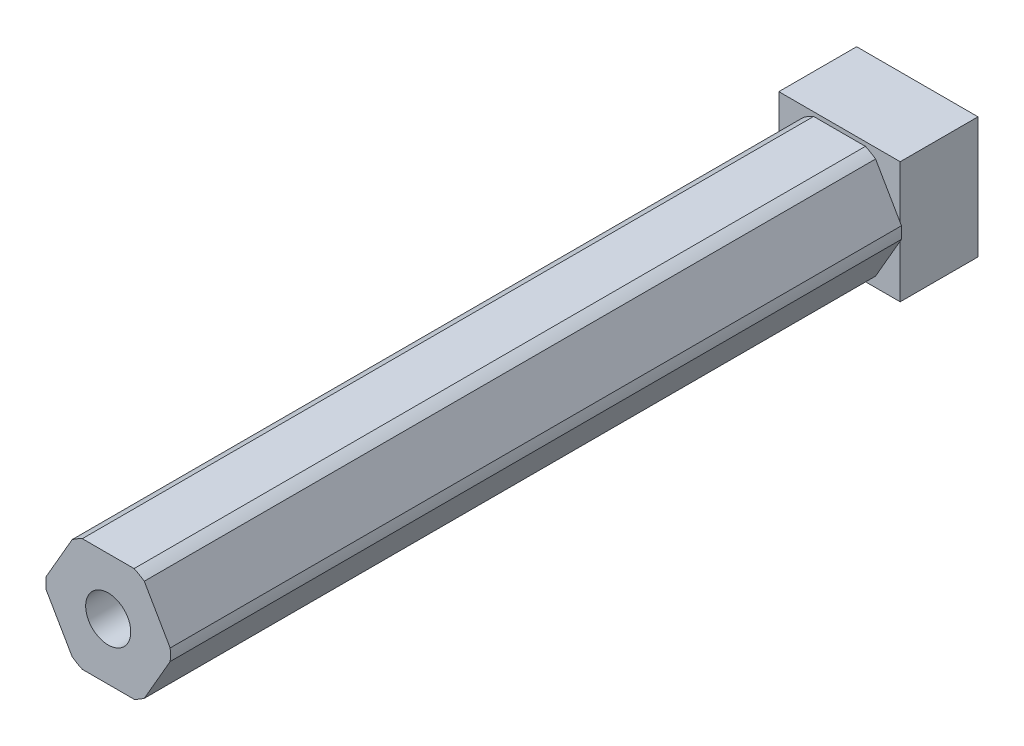
ISO-10303-21;
HEADER;
FILE_DESCRIPTION(('STEP AP214'),'2;1');
FILE_NAME('part.step','',(''),(''),'','','');
FILE_SCHEMA(('AUTOMOTIVE_DESIGN { 1 0 10303 214 1 1 1 1 }'));
ENDSEC;
DATA;
#1=APPLICATION_CONTEXT('core data for automotive mechanical design processes');
#2=APPLICATION_PROTOCOL_DEFINITION('international standard','automotive_design',2000,#1);
#3=PRODUCT_CONTEXT('',#1,'mechanical');
#4=PRODUCT('Part','Part','',(#3));
#5=PRODUCT_RELATED_PRODUCT_CATEGORY('part','',(#4));
#6=PRODUCT_DEFINITION_FORMATION('','',#4);
#7=PRODUCT_DEFINITION_CONTEXT('part definition',#1,'design');
#8=PRODUCT_DEFINITION('design','',#6,#7);
#9=PRODUCT_DEFINITION_SHAPE('','',#8);
#10=(LENGTH_UNIT() NAMED_UNIT(*) SI_UNIT(.MILLI.,.METRE.));
#11=(NAMED_UNIT(*) PLANE_ANGLE_UNIT() SI_UNIT($,.RADIAN.));
#12=(NAMED_UNIT(*) SI_UNIT($,.STERADIAN.) SOLID_ANGLE_UNIT());
#13=UNCERTAINTY_MEASURE_WITH_UNIT(LENGTH_MEASURE(1.E-05),#10,'distance_accuracy_value','');
#14=(GEOMETRIC_REPRESENTATION_CONTEXT(3) GLOBAL_UNCERTAINTY_ASSIGNED_CONTEXT((#13)) GLOBAL_UNIT_ASSIGNED_CONTEXT((#10,
#11,#12)) REPRESENTATION_CONTEXT('',''));
#15=CARTESIAN_POINT('',(0.,0.,0.));
#16=DIRECTION('',(0.,0.,1.));
#17=DIRECTION('',(1.,0.,0.));
#18=AXIS2_PLACEMENT_3D('',#15,#16,#17);
#19=CARTESIAN_POINT('',(0.,0.,0.));
#20=DIRECTION('',(0.,0.,1.));
#21=DIRECTION('',(1.,0.,0.));
#22=AXIS2_PLACEMENT_3D('',#19,#20,#21);
#23=PLANE('',#22);
#24=DIRECTION('',(0.,1.,0.));
#25=VECTOR('',#24,1.);
#26=CARTESIAN_POINT('',(-3.9,-3.9,0.));
#27=LINE('',#26,#25);
#28=CARTESIAN_POINT('',(-3.9,-0.519615242270667,0.));
#29=VERTEX_POINT('',#28);
#30=CARTESIAN_POINT('',(-3.9,0.519615242270666,0.));
#31=VERTEX_POINT('',#30);
#32=EDGE_CURVE('E11',#29,#31,#27,.T.);
#33=ORIENTED_EDGE('',*,*,#32,.F.);
#34=DIRECTION('',(0.5,-0.866025403784439,0.));
#35=VECTOR('',#34,1.);
#36=CARTESIAN_POINT('',(-3.98216584885466,-0.377299817407367,0.));
#37=LINE('',#36,#35);
#38=CARTESIAN_POINT('',(-3.98216584885466,-0.377299817407367,0.));
#39=VERTEX_POINT('',#38);
#40=EDGE_CURVE('E237',#39,#29,#37,.T.);
#41=ORIENTED_EDGE('',*,*,#40,.F.);
#42=CARTESIAN_POINT('',(0.,0.,0.));
#43=DIRECTION('',(0.,0.,1.));
#44=DIRECTION('',(1.,0.,0.));
#45=AXIS2_PLACEMENT_3D('',#42,#43,#44);
#46=CIRCLE('',#45,4.);
#47=CARTESIAN_POINT('',(-3.98216584885466,0.377299817407364,0.));
#48=VERTEX_POINT('',#47);
#49=EDGE_CURVE('E234',#48,#39,#46,.T.);
#50=ORIENTED_EDGE('',*,*,#49,.F.);
#51=DIRECTION('',(-0.5,-0.866025403784439,0.));
#52=VECTOR('',#51,1.);
#53=CARTESIAN_POINT('',(-2.31783415114534,3.26000687848728,0.));
#54=LINE('',#53,#52);
#55=EDGE_CURVE('E60',#31,#48,#54,.T.);
#56=ORIENTED_EDGE('',*,*,#55,.F.);
#57=EDGE_LOOP('',(#33,#41,#50,#56));
#58=FACE_BOUND('',#57,.T.);
#59=ADVANCED_FACE('F41',(#58),#23,.F.);
#60=DIRECTION('',(0.,-1.,0.));
#61=VECTOR('',#60,1.);
#62=CARTESIAN_POINT('',(3.9,-3.9,0.));
#63=LINE('',#62,#61);
#64=CARTESIAN_POINT('',(3.9,0.519615242270664,0.));
#65=VERTEX_POINT('',#64);
#66=CARTESIAN_POINT('',(3.9,-0.51961524227066,0.));
#67=VERTEX_POINT('',#66);
#68=EDGE_CURVE('E50',#65,#67,#63,.T.);
#69=ORIENTED_EDGE('',*,*,#68,.F.);
#70=DIRECTION('',(-0.5,0.866025403784439,0.));
#71=VECTOR('',#70,1.);
#72=CARTESIAN_POINT('',(3.98216584885466,0.377299817407363,0.));
#73=LINE('',#72,#71);
#74=CARTESIAN_POINT('',(3.98216584885466,0.377299817407363,0.));
#75=VERTEX_POINT('',#74);
#76=EDGE_CURVE('E206',#75,#65,#73,.T.);
#77=ORIENTED_EDGE('',*,*,#76,.F.);
#78=CARTESIAN_POINT('',(0.,0.,0.));
#79=DIRECTION('',(0.,0.,1.));
#80=DIRECTION('',(1.,0.,0.));
#81=AXIS2_PLACEMENT_3D('',#78,#79,#80);
#82=CIRCLE('',#81,4.);
#83=CARTESIAN_POINT('',(3.98216584885466,-0.377299817407363,0.));
#84=VERTEX_POINT('',#83);
#85=EDGE_CURVE('E248',#84,#75,#82,.T.);
#86=ORIENTED_EDGE('',*,*,#85,.F.);
#87=DIRECTION('',(0.499999999999999,0.866025403784439,0.));
#88=VECTOR('',#87,1.);
#89=CARTESIAN_POINT('',(2.31783415114534,-3.26000687848728,0.));
#90=LINE('',#89,#88);
#91=EDGE_CURVE('E245',#67,#84,#90,.T.);
#92=ORIENTED_EDGE('',*,*,#91,.F.);
#93=EDGE_LOOP('',(#69,#77,#86,#92));
#94=FACE_BOUND('',#93,.T.);
#95=ADVANCED_FACE('F331',(#94),#23,.F.);
#96=CARTESIAN_POINT('',(0.,0.,47.));
#97=DIRECTION('',(0.,0.,-1.));
#98=DIRECTION('',(-1.,0.,0.));
#99=AXIS2_PLACEMENT_3D('',#96,#97,#98);
#100=CYLINDRICAL_SURFACE('',#99,4.);
#101=CARTESIAN_POINT('',(0.,0.,0.));
#102=DIRECTION('',(0.,0.,1.));
#103=DIRECTION('',(1.,0.,0.));
#104=AXIS2_PLACEMENT_3D('',#101,#102,#103);
#105=CIRCLE('',#104,4.);
#106=CARTESIAN_POINT('',(2.31783415114534,3.26000687848728,0.));
#107=VERTEX_POINT('',#106);
#108=CARTESIAN_POINT('',(1.66433169770932,3.63730669589464,0.));
#109=VERTEX_POINT('',#108);
#110=EDGE_CURVE('E193',#107,#109,#105,.T.);
#111=ORIENTED_EDGE('',*,*,#110,.T.);
#112=DIRECTION('',(0.,0.,-1.));
#113=VECTOR('',#112,1.);
#114=CARTESIAN_POINT('',(1.66433169770932,3.63730669589464,47.));
#115=LINE('',#114,#113);
#116=CARTESIAN_POINT('',(1.66433169770932,3.63730669589464,47.));
#117=VERTEX_POINT('',#116);
#118=EDGE_CURVE('E284',#117,#109,#115,.T.);
#119=ORIENTED_EDGE('',*,*,#118,.F.);
#120=CARTESIAN_POINT('',(0.,0.,47.));
#121=DIRECTION('',(0.,0.,1.));
#122=DIRECTION('',(1.,0.,0.));
#123=AXIS2_PLACEMENT_3D('',#120,#121,#122);
#124=CIRCLE('',#123,4.);
#125=CARTESIAN_POINT('',(2.31783415114534,3.26000687848728,47.));
#126=VERTEX_POINT('',#125);
#127=EDGE_CURVE('E202',#126,#117,#124,.T.);
#128=ORIENTED_EDGE('',*,*,#127,.F.);
#129=DIRECTION('',(0.,0.,-1.));
#130=VECTOR('',#129,1.);
#131=CARTESIAN_POINT('',(2.31783415114534,3.26000687848728,47.));
#132=LINE('',#131,#130);
#133=EDGE_CURVE('E227',#126,#107,#132,.T.);
#134=ORIENTED_EDGE('',*,*,#133,.T.);
#135=EDGE_LOOP('',(#111,#119,#128,#134));
#136=FACE_BOUND('',#135,.T.);
#137=ADVANCED_FACE('F43',(#136),#100,.T.);
#138=CARTESIAN_POINT('',(1.66433169770932,3.63730669589464,47.));
#139=DIRECTION('',(0.,-1.,0.));
#140=DIRECTION('',(0.,0.,-1.));
#141=AXIS2_PLACEMENT_3D('',#138,#139,#140);
#142=PLANE('',#141);
#143=DIRECTION('',(-1.,0.,0.));
#144=VECTOR('',#143,1.);
#145=CARTESIAN_POINT('',(1.66433169770932,3.63730669589464,0.));
#146=LINE('',#145,#144);
#147=CARTESIAN_POINT('',(-1.66433169770932,3.63730669589464,0.));
#148=VERTEX_POINT('',#147);
#149=EDGE_CURVE('E196',#109,#148,#146,.T.);
#150=ORIENTED_EDGE('',*,*,#149,.T.);
#151=DIRECTION('',(0.,0.,-1.));
#152=VECTOR('',#151,1.);
#153=CARTESIAN_POINT('',(-1.66433169770932,3.63730669589464,47.));
#154=LINE('',#153,#152);
#155=CARTESIAN_POINT('',(-1.66433169770932,3.63730669589464,47.));
#156=VERTEX_POINT('',#155);
#157=EDGE_CURVE('E282',#156,#148,#154,.T.);
#158=ORIENTED_EDGE('',*,*,#157,.F.);
#159=DIRECTION('',(-1.,0.,0.));
#160=VECTOR('',#159,1.);
#161=CARTESIAN_POINT('',(1.66433169770932,3.63730669589464,47.));
#162=LINE('',#161,#160);
#163=EDGE_CURVE('E205',#117,#156,#162,.T.);
#164=ORIENTED_EDGE('',*,*,#163,.F.);
#165=ORIENTED_EDGE('',*,*,#118,.T.);
#166=EDGE_LOOP('',(#150,#158,#164,#165));
#167=FACE_BOUND('',#166,.T.);
#168=ADVANCED_FACE('F379',(#167),#142,.F.);
#169=CARTESIAN_POINT('',(0.,0.,47.));
#170=DIRECTION('',(0.,0.,-1.));
#171=DIRECTION('',(-1.,0.,0.));
#172=AXIS2_PLACEMENT_3D('',#169,#170,#171);
#173=CYLINDRICAL_SURFACE('',#172,4.);
#174=CARTESIAN_POINT('',(0.,0.,0.));
#175=DIRECTION('',(0.,0.,1.));
#176=DIRECTION('',(1.,0.,0.));
#177=AXIS2_PLACEMENT_3D('',#174,#175,#176);
#178=CIRCLE('',#177,4.);
#179=CARTESIAN_POINT('',(-2.31783415114534,3.26000687848728,0.));
#180=VERTEX_POINT('',#179);
#181=EDGE_CURVE('E230',#148,#180,#178,.T.);
#182=ORIENTED_EDGE('',*,*,#181,.T.);
#183=DIRECTION('',(0.,0.,-1.));
#184=VECTOR('',#183,1.);
#185=CARTESIAN_POINT('',(-2.31783415114534,3.26000687848728,47.));
#186=LINE('',#185,#184);
#187=CARTESIAN_POINT('',(-2.31783415114534,3.26000687848728,47.));
#188=VERTEX_POINT('',#187);
#189=EDGE_CURVE('E279',#188,#180,#186,.T.);
#190=ORIENTED_EDGE('',*,*,#189,.F.);
#191=CARTESIAN_POINT('',(0.,0.,47.));
#192=DIRECTION('',(0.,0.,1.));
#193=DIRECTION('',(1.,0.,0.));
#194=AXIS2_PLACEMENT_3D('',#191,#192,#193);
#195=CIRCLE('',#194,4.);
#196=EDGE_CURVE('E208',#156,#188,#195,.T.);
#197=ORIENTED_EDGE('',*,*,#196,.F.);
#198=ORIENTED_EDGE('',*,*,#157,.T.);
#199=EDGE_LOOP('',(#182,#190,#197,#198));
#200=FACE_BOUND('',#199,.T.);
#201=ADVANCED_FACE('F376',(#200),#173,.T.);
#202=CARTESIAN_POINT('',(-2.31783415114534,3.26000687848728,47.));
#203=DIRECTION('',(0.866025403784439,-0.5,0.));
#204=DIRECTION('',(0.5,0.866025403784439,0.));
#205=AXIS2_PLACEMENT_3D('',#202,#203,#204);
#206=PLANE('',#205);
#207=EDGE_CURVE('E232',#180,#31,#54,.T.);
#208=ORIENTED_EDGE('',*,*,#207,.T.);
#209=ORIENTED_EDGE('',*,*,#55,.T.);
#210=DIRECTION('',(0.,0.,-1.));
#211=VECTOR('',#210,1.);
#212=CARTESIAN_POINT('',(-3.98216584885466,0.377299817407364,47.));
#213=LINE('',#212,#211);
#214=CARTESIAN_POINT('',(-3.98216584885466,0.377299817407364,47.));
#215=VERTEX_POINT('',#214);
#216=EDGE_CURVE('E276',#215,#48,#213,.T.);
#217=ORIENTED_EDGE('',*,*,#216,.F.);
#218=DIRECTION('',(-0.5,-0.866025403784439,0.));
#219=VECTOR('',#218,1.);
#220=CARTESIAN_POINT('',(-2.31783415114534,3.26000687848728,47.));
#221=LINE('',#220,#219);
#222=EDGE_CURVE('E210',#188,#215,#221,.T.);
#223=ORIENTED_EDGE('',*,*,#222,.F.);
#224=ORIENTED_EDGE('',*,*,#189,.T.);
#225=EDGE_LOOP('',(#208,#209,#217,#223,#224));
#226=FACE_BOUND('',#225,.T.);
#227=ADVANCED_FACE('F372',(#226),#206,.F.);
#228=CARTESIAN_POINT('',(0.,0.,47.));
#229=DIRECTION('',(0.,0.,-1.));
#230=DIRECTION('',(-1.,0.,0.));
#231=AXIS2_PLACEMENT_3D('',#228,#229,#230);
#232=CYLINDRICAL_SURFACE('',#231,4.);
#233=ORIENTED_EDGE('',*,*,#49,.T.);
#234=DIRECTION('',(0.,0.,-1.));
#235=VECTOR('',#234,1.);
#236=CARTESIAN_POINT('',(-3.98216584885466,-0.377299817407367,47.));
#237=LINE('',#236,#235);
#238=CARTESIAN_POINT('',(-3.98216584885466,-0.377299817407367,47.));
#239=VERTEX_POINT('',#238);
#240=EDGE_CURVE('E273',#239,#39,#237,.T.);
#241=ORIENTED_EDGE('',*,*,#240,.F.);
#242=CARTESIAN_POINT('',(0.,0.,47.));
#243=DIRECTION('',(0.,0.,1.));
#244=DIRECTION('',(1.,0.,0.));
#245=AXIS2_PLACEMENT_3D('',#242,#243,#244);
#246=CIRCLE('',#245,4.);
#247=EDGE_CURVE('E212',#215,#239,#246,.T.);
#248=ORIENTED_EDGE('',*,*,#247,.F.);
#249=ORIENTED_EDGE('',*,*,#216,.T.);
#250=EDGE_LOOP('',(#233,#241,#248,#249));
#251=FACE_BOUND('',#250,.T.);
#252=ADVANCED_FACE('F368',(#251),#232,.T.);
#253=CARTESIAN_POINT('',(-3.98216584885466,-0.377299817407367,47.));
#254=DIRECTION('',(0.866025403784438,0.5,0.));
#255=DIRECTION('',(-0.5,0.866025403784439,0.));
#256=AXIS2_PLACEMENT_3D('',#253,#254,#255);
#257=PLANE('',#256);
#258=ORIENTED_EDGE('',*,*,#40,.T.);
#259=CARTESIAN_POINT('',(-2.31783415114534,-3.26000687848728,0.));
#260=VERTEX_POINT('',#259);
#261=EDGE_CURVE('E236',#29,#260,#37,.T.);
#262=ORIENTED_EDGE('',*,*,#261,.T.);
#263=DIRECTION('',(0.,0.,-1.));
#264=VECTOR('',#263,1.);
#265=CARTESIAN_POINT('',(-2.31783415114534,-3.26000687848728,47.));
#266=LINE('',#265,#264);
#267=CARTESIAN_POINT('',(-2.31783415114534,-3.26000687848728,47.));
#268=VERTEX_POINT('',#267);
#269=EDGE_CURVE('E270',#268,#260,#266,.T.);
#270=ORIENTED_EDGE('',*,*,#269,.F.);
#271=DIRECTION('',(0.5,-0.866025403784439,0.));
#272=VECTOR('',#271,1.);
#273=CARTESIAN_POINT('',(-3.98216584885466,-0.377299817407367,47.));
#274=LINE('',#273,#272);
#275=EDGE_CURVE('E214',#239,#268,#274,.T.);
#276=ORIENTED_EDGE('',*,*,#275,.F.);
#277=ORIENTED_EDGE('',*,*,#240,.T.);
#278=EDGE_LOOP('',(#258,#262,#270,#276,#277));
#279=FACE_BOUND('',#278,.T.);
#280=ADVANCED_FACE('F364',(#279),#257,.F.);
#281=CARTESIAN_POINT('',(0.,0.,47.));
#282=DIRECTION('',(0.,0.,-1.));
#283=DIRECTION('',(-1.,0.,0.));
#284=AXIS2_PLACEMENT_3D('',#281,#282,#283);
#285=CYLINDRICAL_SURFACE('',#284,4.);
#286=CARTESIAN_POINT('',(0.,0.,0.));
#287=DIRECTION('',(0.,0.,1.));
#288=DIRECTION('',(1.,0.,0.));
#289=AXIS2_PLACEMENT_3D('',#286,#287,#288);
#290=CIRCLE('',#289,4.);
#291=CARTESIAN_POINT('',(-1.66433169770932,-3.63730669589464,0.));
#292=VERTEX_POINT('',#291);
#293=EDGE_CURVE('E239',#260,#292,#290,.T.);
#294=ORIENTED_EDGE('',*,*,#293,.T.);
#295=DIRECTION('',(0.,0.,-1.));
#296=VECTOR('',#295,1.);
#297=CARTESIAN_POINT('',(-1.66433169770932,-3.63730669589464,47.));
#298=LINE('',#297,#296);
#299=CARTESIAN_POINT('',(-1.66433169770932,-3.63730669589464,47.));
#300=VERTEX_POINT('',#299);
#301=EDGE_CURVE('E267',#300,#292,#298,.T.);
#302=ORIENTED_EDGE('',*,*,#301,.F.);
#303=CARTESIAN_POINT('',(0.,0.,47.));
#304=DIRECTION('',(0.,0.,1.));
#305=DIRECTION('',(1.,0.,0.));
#306=AXIS2_PLACEMENT_3D('',#303,#304,#305);
#307=CIRCLE('',#306,4.);
#308=EDGE_CURVE('E216',#268,#300,#307,.T.);
#309=ORIENTED_EDGE('',*,*,#308,.F.);
#310=ORIENTED_EDGE('',*,*,#269,.T.);
#311=EDGE_LOOP('',(#294,#302,#309,#310));
#312=FACE_BOUND('',#311,.T.);
#313=ADVANCED_FACE('F360',(#312),#285,.T.);
#314=CARTESIAN_POINT('',(-1.66433169770932,-3.63730669589464,47.));
#315=DIRECTION('',(0.,1.,0.));
#316=DIRECTION('',(0.,0.,1.));
#317=AXIS2_PLACEMENT_3D('',#314,#315,#316);
#318=PLANE('',#317);
#319=DIRECTION('',(1.,0.,0.));
#320=VECTOR('',#319,1.);
#321=CARTESIAN_POINT('',(-1.66433169770932,-3.63730669589464,0.));
#322=LINE('',#321,#320);
#323=CARTESIAN_POINT('',(1.66433169770932,-3.63730669589464,0.));
#324=VERTEX_POINT('',#323);
#325=EDGE_CURVE('E241',#292,#324,#322,.T.);
#326=ORIENTED_EDGE('',*,*,#325,.T.);
#327=DIRECTION('',(0.,0.,-1.));
#328=VECTOR('',#327,1.);
#329=CARTESIAN_POINT('',(1.66433169770932,-3.63730669589464,47.));
#330=LINE('',#329,#328);
#331=CARTESIAN_POINT('',(1.66433169770932,-3.63730669589464,47.));
#332=VERTEX_POINT('',#331);
#333=EDGE_CURVE('E264',#332,#324,#330,.T.);
#334=ORIENTED_EDGE('',*,*,#333,.F.);
#335=DIRECTION('',(1.,0.,0.));
#336=VECTOR('',#335,1.);
#337=CARTESIAN_POINT('',(-1.66433169770932,-3.63730669589464,47.));
#338=LINE('',#337,#336);
#339=EDGE_CURVE('E218',#300,#332,#338,.T.);
#340=ORIENTED_EDGE('',*,*,#339,.F.);
#341=ORIENTED_EDGE('',*,*,#301,.T.);
#342=EDGE_LOOP('',(#326,#334,#340,#341));
#343=FACE_BOUND('',#342,.T.);
#344=ADVANCED_FACE('F356',(#343),#318,.F.);
#345=CARTESIAN_POINT('',(0.,0.,47.));
#346=DIRECTION('',(0.,0.,-1.));
#347=DIRECTION('',(-1.,0.,0.));
#348=AXIS2_PLACEMENT_3D('',#345,#346,#347);
#349=CYLINDRICAL_SURFACE('',#348,4.);
#350=CARTESIAN_POINT('',(0.,0.,0.));
#351=DIRECTION('',(0.,0.,1.));
#352=DIRECTION('',(1.,0.,0.));
#353=AXIS2_PLACEMENT_3D('',#350,#351,#352);
#354=CIRCLE('',#353,4.);
#355=CARTESIAN_POINT('',(2.31783415114534,-3.26000687848728,0.));
#356=VERTEX_POINT('',#355);
#357=EDGE_CURVE('E243',#324,#356,#354,.T.);
#358=ORIENTED_EDGE('',*,*,#357,.T.);
#359=DIRECTION('',(0.,0.,-1.));
#360=VECTOR('',#359,1.);
#361=CARTESIAN_POINT('',(2.31783415114534,-3.26000687848728,47.));
#362=LINE('',#361,#360);
#363=CARTESIAN_POINT('',(2.31783415114534,-3.26000687848728,47.));
#364=VERTEX_POINT('',#363);
#365=EDGE_CURVE('E261',#364,#356,#362,.T.);
#366=ORIENTED_EDGE('',*,*,#365,.F.);
#367=CARTESIAN_POINT('',(0.,0.,47.));
#368=DIRECTION('',(0.,0.,1.));
#369=DIRECTION('',(1.,0.,0.));
#370=AXIS2_PLACEMENT_3D('',#367,#368,#369);
#371=CIRCLE('',#370,4.);
#372=EDGE_CURVE('E220',#332,#364,#371,.T.);
#373=ORIENTED_EDGE('',*,*,#372,.F.);
#374=ORIENTED_EDGE('',*,*,#333,.T.);
#375=EDGE_LOOP('',(#358,#366,#373,#374));
#376=FACE_BOUND('',#375,.T.);
#377=ADVANCED_FACE('F352',(#376),#349,.T.);
#378=CARTESIAN_POINT('',(2.31783415114534,-3.26000687848728,47.));
#379=DIRECTION('',(-0.866025403784439,0.499999999999999,0.));
#380=DIRECTION('',(-0.499999999999999,-0.866025403784439,0.));
#381=AXIS2_PLACEMENT_3D('',#378,#379,#380);
#382=PLANE('',#381);
#383=EDGE_CURVE('E246',#356,#67,#90,.T.);
#384=ORIENTED_EDGE('',*,*,#383,.T.);
#385=ORIENTED_EDGE('',*,*,#91,.T.);
#386=DIRECTION('',(0.,0.,-1.));
#387=VECTOR('',#386,1.);
#388=CARTESIAN_POINT('',(3.98216584885466,-0.377299817407363,47.));
#389=LINE('',#388,#387);
#390=CARTESIAN_POINT('',(3.98216584885466,-0.377299817407363,47.));
#391=VERTEX_POINT('',#390);
#392=EDGE_CURVE('E258',#391,#84,#389,.T.);
#393=ORIENTED_EDGE('',*,*,#392,.F.);
#394=DIRECTION('',(0.499999999999999,0.866025403784439,0.));
#395=VECTOR('',#394,1.);
#396=CARTESIAN_POINT('',(2.31783415114534,-3.26000687848728,47.));
#397=LINE('',#396,#395);
#398=EDGE_CURVE('E222',#364,#391,#397,.T.);
#399=ORIENTED_EDGE('',*,*,#398,.F.);
#400=ORIENTED_EDGE('',*,*,#365,.T.);
#401=EDGE_LOOP('',(#384,#385,#393,#399,#400));
#402=FACE_BOUND('',#401,.T.);
#403=ADVANCED_FACE('F348',(#402),#382,.F.);
#404=CARTESIAN_POINT('',(0.,0.,47.));
#405=DIRECTION('',(0.,0.,-1.));
#406=DIRECTION('',(-1.,0.,0.));
#407=AXIS2_PLACEMENT_3D('',#404,#405,#406);
#408=CYLINDRICAL_SURFACE('',#407,4.);
#409=ORIENTED_EDGE('',*,*,#85,.T.);
#410=DIRECTION('',(0.,0.,-1.));
#411=VECTOR('',#410,1.);
#412=CARTESIAN_POINT('',(3.98216584885466,0.377299817407363,47.));
#413=LINE('',#412,#411);
#414=CARTESIAN_POINT('',(3.98216584885466,0.377299817407363,47.));
#415=VERTEX_POINT('',#414);
#416=EDGE_CURVE('E255',#415,#75,#413,.T.);
#417=ORIENTED_EDGE('',*,*,#416,.F.);
#418=CARTESIAN_POINT('',(0.,0.,47.));
#419=DIRECTION('',(0.,0.,1.));
#420=DIRECTION('',(1.,0.,0.));
#421=AXIS2_PLACEMENT_3D('',#418,#419,#420);
#422=CIRCLE('',#421,4.);
#423=EDGE_CURVE('E224',#391,#415,#422,.T.);
#424=ORIENTED_EDGE('',*,*,#423,.F.);
#425=ORIENTED_EDGE('',*,*,#392,.T.);
#426=EDGE_LOOP('',(#409,#417,#424,#425));
#427=FACE_BOUND('',#426,.T.);
#428=ADVANCED_FACE('F345',(#427),#408,.T.);
#429=CARTESIAN_POINT('',(3.98216584885466,0.377299817407363,47.));
#430=DIRECTION('',(-0.866025403784439,-0.5,0.));
#431=DIRECTION('',(0.5,-0.866025403784439,0.));
#432=AXIS2_PLACEMENT_3D('',#429,#430,#431);
#433=PLANE('',#432);
#434=ORIENTED_EDGE('',*,*,#76,.T.);
#435=EDGE_CURVE('E250',#65,#107,#73,.T.);
#436=ORIENTED_EDGE('',*,*,#435,.T.);
#437=ORIENTED_EDGE('',*,*,#133,.F.);
#438=DIRECTION('',(-0.5,0.866025403784439,0.));
#439=VECTOR('',#438,1.);
#440=CARTESIAN_POINT('',(3.98216584885466,0.377299817407363,47.));
#441=LINE('',#440,#439);
#442=EDGE_CURVE('E226',#415,#126,#441,.T.);
#443=ORIENTED_EDGE('',*,*,#442,.F.);
#444=ORIENTED_EDGE('',*,*,#416,.T.);
#445=EDGE_LOOP('',(#434,#436,#437,#443,#444));
#446=FACE_BOUND('',#445,.T.);
#447=ADVANCED_FACE('F342',(#446),#433,.F.);
#448=CARTESIAN_POINT('',(0.,0.,47.));
#449=DIRECTION('',(0.,0.,1.));
#450=DIRECTION('',(1.,0.,0.));
#451=AXIS2_PLACEMENT_3D('',#448,#449,#450);
#452=PLANE('',#451);
#453=CARTESIAN_POINT('',(0.,0.,47.));
#454=DIRECTION('',(0.,0.,-1.));
#455=DIRECTION('',(-1.,0.,0.));
#456=AXIS2_PLACEMENT_3D('',#453,#454,#455);
#457=CIRCLE('',#456,1.45);
#458=CARTESIAN_POINT('',(-1.45,0.,47.));
#459=VERTEX_POINT('',#458);
#460=EDGE_CURVE('E313',#459,#459,#457,.T.);
#461=ORIENTED_EDGE('',*,*,#460,.T.);
#462=EDGE_LOOP('',(#461));
#463=FACE_BOUND('',#462,.T.);
#464=ORIENTED_EDGE('',*,*,#127,.T.);
#465=ORIENTED_EDGE('',*,*,#163,.T.);
#466=ORIENTED_EDGE('',*,*,#196,.T.);
#467=ORIENTED_EDGE('',*,*,#222,.T.);
#468=ORIENTED_EDGE('',*,*,#247,.T.);
#469=ORIENTED_EDGE('',*,*,#275,.T.);
#470=ORIENTED_EDGE('',*,*,#308,.T.);
#471=ORIENTED_EDGE('',*,*,#339,.T.);
#472=ORIENTED_EDGE('',*,*,#372,.T.);
#473=ORIENTED_EDGE('',*,*,#398,.T.);
#474=ORIENTED_EDGE('',*,*,#423,.T.);
#475=ORIENTED_EDGE('',*,*,#442,.T.);
#476=EDGE_LOOP('',(#464,#465,#466,#467,#468,#469,#470,#471,#472,#473,#474,#475));
#477=FACE_BOUND('',#476,.T.);
#478=ADVANCED_FACE('F340',(#463,#477),#452,.T.);
#479=CARTESIAN_POINT('',(0.,0.,0.));
#480=DIRECTION('',(0.,0.,1.));
#481=DIRECTION('',(1.,0.,0.));
#482=AXIS2_PLACEMENT_3D('',#479,#480,#481);
#483=PLANE('',#482);
#484=ORIENTED_EDGE('',*,*,#383,.F.);
#485=ORIENTED_EDGE('',*,*,#357,.F.);
#486=ORIENTED_EDGE('',*,*,#325,.F.);
#487=ORIENTED_EDGE('',*,*,#293,.F.);
#488=ORIENTED_EDGE('',*,*,#261,.F.);
#489=CARTESIAN_POINT('',(-3.9,-3.9,0.));
#490=VERTEX_POINT('',#489);
#491=EDGE_CURVE('E52',#490,#29,#27,.T.);
#492=ORIENTED_EDGE('',*,*,#491,.F.);
#493=DIRECTION('',(-1.,0.,0.));
#494=VECTOR('',#493,1.);
#495=CARTESIAN_POINT('',(3.9,-3.9,0.));
#496=LINE('',#495,#494);
#497=CARTESIAN_POINT('',(3.9,-3.9,0.));
#498=VERTEX_POINT('',#497);
#499=EDGE_CURVE('E187',#498,#490,#496,.T.);
#500=ORIENTED_EDGE('',*,*,#499,.F.);
#501=EDGE_CURVE('E290',#67,#498,#63,.T.);
#502=ORIENTED_EDGE('',*,*,#501,.F.);
#503=EDGE_LOOP('',(#484,#485,#486,#487,#488,#492,#500,#502));
#504=FACE_BOUND('',#503,.T.);
#505=ADVANCED_FACE('F414',(#504),#483,.T.);
#506=ORIENTED_EDGE('',*,*,#435,.F.);
#507=CARTESIAN_POINT('',(3.9,3.9,0.));
#508=VERTEX_POINT('',#507);
#509=EDGE_CURVE('E289',#508,#65,#63,.T.);
#510=ORIENTED_EDGE('',*,*,#509,.F.);
#511=DIRECTION('',(1.,0.,0.));
#512=VECTOR('',#511,1.);
#513=CARTESIAN_POINT('',(3.9,3.9,0.));
#514=LINE('',#513,#512);
#515=CARTESIAN_POINT('',(-3.9,3.9,0.));
#516=VERTEX_POINT('',#515);
#517=EDGE_CURVE('E295',#516,#508,#514,.T.);
#518=ORIENTED_EDGE('',*,*,#517,.F.);
#519=EDGE_CURVE('E53',#31,#516,#27,.T.);
#520=ORIENTED_EDGE('',*,*,#519,.F.);
#521=ORIENTED_EDGE('',*,*,#207,.F.);
#522=ORIENTED_EDGE('',*,*,#181,.F.);
#523=ORIENTED_EDGE('',*,*,#149,.F.);
#524=ORIENTED_EDGE('',*,*,#110,.F.);
#525=EDGE_LOOP('',(#506,#510,#518,#520,#521,#522,#523,#524));
#526=FACE_BOUND('',#525,.T.);
#527=ADVANCED_FACE('F395',(#526),#483,.T.);
#528=CARTESIAN_POINT('',(-3.9,-3.9,-5.));
#529=DIRECTION('',(1.,0.,0.));
#530=DIRECTION('',(0.,0.,-1.));
#531=AXIS2_PLACEMENT_3D('',#528,#529,#530);
#532=PLANE('',#531);
#533=ORIENTED_EDGE('',*,*,#491,.T.);
#534=ORIENTED_EDGE('',*,*,#32,.T.);
#535=ORIENTED_EDGE('',*,*,#519,.T.);
#536=DIRECTION('',(0.,0.,1.));
#537=VECTOR('',#536,1.);
#538=CARTESIAN_POINT('',(-3.9,3.9,-5.));
#539=LINE('',#538,#537);
#540=CARTESIAN_POINT('',(-3.9,3.9,-5.));
#541=VERTEX_POINT('',#540);
#542=EDGE_CURVE('E172',#541,#516,#539,.T.);
#543=ORIENTED_EDGE('',*,*,#542,.F.);
#544=DIRECTION('',(0.,1.,0.));
#545=VECTOR('',#544,1.);
#546=CARTESIAN_POINT('',(-3.9,-3.9,-5.));
#547=LINE('',#546,#545);
#548=CARTESIAN_POINT('',(-3.9,-3.9,-5.));
#549=VERTEX_POINT('',#548);
#550=EDGE_CURVE('E178',#549,#541,#547,.T.);
#551=ORIENTED_EDGE('',*,*,#550,.F.);
#552=DIRECTION('',(0.,0.,1.));
#553=VECTOR('',#552,1.);
#554=CARTESIAN_POINT('',(-3.9,-3.9,-5.));
#555=LINE('',#554,#553);
#556=EDGE_CURVE('E301',#549,#490,#555,.T.);
#557=ORIENTED_EDGE('',*,*,#556,.T.);
#558=EDGE_LOOP('',(#533,#534,#535,#543,#551,#557));
#559=FACE_BOUND('',#558,.T.);
#560=ADVANCED_FACE('F190',(#559),#532,.F.);
#561=CARTESIAN_POINT('',(3.9,3.9,-5.));
#562=DIRECTION('',(0.,-1.,0.));
#563=DIRECTION('',(0.,0.,-1.));
#564=AXIS2_PLACEMENT_3D('',#561,#562,#563);
#565=PLANE('',#564);
#566=ORIENTED_EDGE('',*,*,#517,.T.);
#567=DIRECTION('',(0.,0.,1.));
#568=VECTOR('',#567,1.);
#569=CARTESIAN_POINT('',(3.9,3.9,-5.));
#570=LINE('',#569,#568);
#571=CARTESIAN_POINT('',(3.9,3.9,-5.));
#572=VERTEX_POINT('',#571);
#573=EDGE_CURVE('E174',#572,#508,#570,.T.);
#574=ORIENTED_EDGE('',*,*,#573,.F.);
#575=DIRECTION('',(1.,0.,0.));
#576=VECTOR('',#575,1.);
#577=CARTESIAN_POINT('',(3.9,3.9,-5.));
#578=LINE('',#577,#576);
#579=EDGE_CURVE('E168',#541,#572,#578,.T.);
#580=ORIENTED_EDGE('',*,*,#579,.F.);
#581=ORIENTED_EDGE('',*,*,#542,.T.);
#582=EDGE_LOOP('',(#566,#574,#580,#581));
#583=FACE_BOUND('',#582,.T.);
#584=ADVANCED_FACE('F170',(#583),#565,.F.);
#585=CARTESIAN_POINT('',(3.9,-3.9,-5.));
#586=DIRECTION('',(-1.,0.,0.));
#587=DIRECTION('',(0.,0.,1.));
#588=AXIS2_PLACEMENT_3D('',#585,#586,#587);
#589=PLANE('',#588);
#590=ORIENTED_EDGE('',*,*,#509,.T.);
#591=ORIENTED_EDGE('',*,*,#68,.T.);
#592=ORIENTED_EDGE('',*,*,#501,.T.);
#593=DIRECTION('',(0.,0.,1.));
#594=VECTOR('',#593,1.);
#595=CARTESIAN_POINT('',(3.9,-3.9,-5.));
#596=LINE('',#595,#594);
#597=CARTESIAN_POINT('',(3.9,-3.9,-5.));
#598=VERTEX_POINT('',#597);
#599=EDGE_CURVE('E198',#598,#498,#596,.T.);
#600=ORIENTED_EDGE('',*,*,#599,.F.);
#601=DIRECTION('',(0.,-1.,0.));
#602=VECTOR('',#601,1.);
#603=CARTESIAN_POINT('',(3.9,-3.9,-5.));
#604=LINE('',#603,#602);
#605=EDGE_CURVE('E177',#572,#598,#604,.T.);
#606=ORIENTED_EDGE('',*,*,#605,.F.);
#607=ORIENTED_EDGE('',*,*,#573,.T.);
#608=EDGE_LOOP('',(#590,#591,#592,#600,#606,#607));
#609=FACE_BOUND('',#608,.T.);
#610=ADVANCED_FACE('F405',(#609),#589,.F.);
#611=CARTESIAN_POINT('',(3.9,-3.9,-5.));
#612=DIRECTION('',(0.,1.,0.));
#613=DIRECTION('',(0.,0.,1.));
#614=AXIS2_PLACEMENT_3D('',#611,#612,#613);
#615=PLANE('',#614);
#616=ORIENTED_EDGE('',*,*,#499,.T.);
#617=ORIENTED_EDGE('',*,*,#556,.F.);
#618=DIRECTION('',(-1.,0.,0.));
#619=VECTOR('',#618,1.);
#620=CARTESIAN_POINT('',(3.9,-3.9,-5.));
#621=LINE('',#620,#619);
#622=EDGE_CURVE('E183',#598,#549,#621,.T.);
#623=ORIENTED_EDGE('',*,*,#622,.F.);
#624=ORIENTED_EDGE('',*,*,#599,.T.);
#625=EDGE_LOOP('',(#616,#617,#623,#624));
#626=FACE_BOUND('',#625,.T.);
#627=ADVANCED_FACE('F408',(#626),#615,.F.);
#628=CARTESIAN_POINT('',(0.,0.,-5.));
#629=DIRECTION('',(0.,0.,1.));
#630=DIRECTION('',(1.,0.,0.));
#631=AXIS2_PLACEMENT_3D('',#628,#629,#630);
#632=PLANE('',#631);
#633=CARTESIAN_POINT('',(0.,0.,-5.));
#634=DIRECTION('',(0.,0.,-1.));
#635=DIRECTION('',(-1.,0.,0.));
#636=AXIS2_PLACEMENT_3D('',#633,#634,#635);
#637=CIRCLE('',#636,3.);
#638=CARTESIAN_POINT('',(-3.,0.,-5.));
#639=VERTEX_POINT('',#638);
#640=EDGE_CURVE('E306',#639,#639,#637,.T.);
#641=ORIENTED_EDGE('',*,*,#640,.F.);
#642=EDGE_LOOP('',(#641));
#643=FACE_BOUND('',#642,.T.);
#644=ORIENTED_EDGE('',*,*,#550,.T.);
#645=ORIENTED_EDGE('',*,*,#579,.T.);
#646=ORIENTED_EDGE('',*,*,#605,.T.);
#647=ORIENTED_EDGE('',*,*,#622,.T.);
#648=EDGE_LOOP('',(#644,#645,#646,#647));
#649=FACE_BOUND('',#648,.T.);
#650=ADVANCED_FACE('F181',(#643,#649),#632,.F.);
#651=CARTESIAN_POINT('',(0.,0.,-2.));
#652=DIRECTION('',(0.,0.,-1.));
#653=DIRECTION('',(-1.,0.,0.));
#654=AXIS2_PLACEMENT_3D('',#651,#652,#653);
#655=PLANE('',#654);
#656=CARTESIAN_POINT('',(0.,0.,-2.));
#657=DIRECTION('',(0.,0.,-1.));
#658=DIRECTION('',(-1.,0.,0.));
#659=AXIS2_PLACEMENT_3D('',#656,#657,#658);
#660=CIRCLE('',#659,3.);
#661=CARTESIAN_POINT('',(-3.,0.,-2.));
#662=VERTEX_POINT('',#661);
#663=EDGE_CURVE('E309',#662,#662,#660,.T.);
#664=ORIENTED_EDGE('',*,*,#663,.T.);
#665=EDGE_LOOP('',(#664));
#666=FACE_BOUND('',#665,.T.);
#667=CARTESIAN_POINT('',(0.,0.,-2.));
#668=DIRECTION('',(0.,0.,-1.));
#669=DIRECTION('',(-1.,0.,0.));
#670=AXIS2_PLACEMENT_3D('',#667,#668,#669);
#671=CIRCLE('',#670,1.45);
#672=CARTESIAN_POINT('',(-1.45,0.,-2.));
#673=VERTEX_POINT('',#672);
#674=EDGE_CURVE('E45',#673,#673,#671,.F.);
#675=ORIENTED_EDGE('',*,*,#674,.T.);
#676=EDGE_LOOP('',(#675));
#677=FACE_BOUND('',#676,.T.);
#678=ADVANCED_FACE('F486',(#666,#677),#655,.T.);
#679=CARTESIAN_POINT('',(0.,0.,-2.));
#680=DIRECTION('',(0.,0.,-1.));
#681=DIRECTION('',(-1.,0.,0.));
#682=AXIS2_PLACEMENT_3D('',#679,#680,#681);
#683=CYLINDRICAL_SURFACE('',#682,3.);
#684=ORIENTED_EDGE('',*,*,#663,.F.);
#685=EDGE_LOOP('',(#684));
#686=FACE_BOUND('',#685,.T.);
#687=ORIENTED_EDGE('',*,*,#640,.T.);
#688=EDGE_LOOP('',(#687));
#689=FACE_BOUND('',#688,.T.);
#690=ADVANCED_FACE('F477',(#686,#689),#683,.F.);
#691=CARTESIAN_POINT('',(0.,0.,7.5));
#692=DIRECTION('',(0.,0.,-1.));
#693=DIRECTION('',(-1.,0.,0.));
#694=AXIS2_PLACEMENT_3D('',#691,#692,#693);
#695=PLANE('',#694);
#696=CARTESIAN_POINT('',(0.,0.,7.5));
#697=DIRECTION('',(0.,0.,-1.));
#698=DIRECTION('',(-1.,0.,0.));
#699=AXIS2_PLACEMENT_3D('',#696,#697,#698);
#700=CIRCLE('',#699,1.45);
#701=CARTESIAN_POINT('',(-1.45,0.,7.5));
#702=VERTEX_POINT('',#701);
#703=EDGE_CURVE('E303',#702,#702,#700,.T.);
#704=ORIENTED_EDGE('',*,*,#703,.T.);
#705=EDGE_LOOP('',(#704));
#706=FACE_BOUND('',#705,.T.);
#707=ADVANCED_FACE('F473',(#706),#695,.T.);
#708=CARTESIAN_POINT('',(0.,0.,7.5));
#709=DIRECTION('',(0.,0.,-1.));
#710=DIRECTION('',(-1.,0.,0.));
#711=AXIS2_PLACEMENT_3D('',#708,#709,#710);
#712=CYLINDRICAL_SURFACE('',#711,1.45);
#713=ORIENTED_EDGE('',*,*,#703,.F.);
#714=EDGE_LOOP('',(#713));
#715=FACE_BOUND('',#714,.T.);
#716=ORIENTED_EDGE('',*,*,#674,.F.);
#717=EDGE_LOOP('',(#716));
#718=FACE_BOUND('',#717,.T.);
#719=ADVANCED_FACE('F328',(#715,#718),#712,.F.);
#720=CARTESIAN_POINT('',(0.,0.,37.5));
#721=DIRECTION('',(0.,0.,1.));
#722=DIRECTION('',(1.,0.,0.));
#723=AXIS2_PLACEMENT_3D('',#720,#721,#722);
#724=CYLINDRICAL_SURFACE('',#723,1.45);
#725=CARTESIAN_POINT('',(0.,0.,37.5));
#726=DIRECTION('',(0.,0.,-1.));
#727=DIRECTION('',(-1.,0.,0.));
#728=AXIS2_PLACEMENT_3D('',#725,#726,#727);
#729=CIRCLE('',#728,1.45);
#730=CARTESIAN_POINT('',(-1.45,0.,37.5));
#731=VERTEX_POINT('',#730);
#732=EDGE_CURVE('E310',#731,#731,#729,.T.);
#733=ORIENTED_EDGE('',*,*,#732,.T.);
#734=EDGE_LOOP('',(#733));
#735=FACE_BOUND('',#734,.T.);
#736=ORIENTED_EDGE('',*,*,#460,.F.);
#737=EDGE_LOOP('',(#736));
#738=FACE_BOUND('',#737,.T.);
#739=ADVANCED_FACE('F319',(#735,#738),#724,.F.);
#740=CARTESIAN_POINT('',(0.,0.,37.5));
#741=DIRECTION('',(0.,0.,-1.));
#742=DIRECTION('',(-1.,0.,0.));
#743=AXIS2_PLACEMENT_3D('',#740,#741,#742);
#744=PLANE('',#743);
#745=ORIENTED_EDGE('',*,*,#732,.F.);
#746=EDGE_LOOP('',(#745));
#747=FACE_BOUND('',#746,.T.);
#748=ADVANCED_FACE('F322',(#747),#744,.F.);
#749=CLOSED_SHELL('',(#59,#95,#137,#168,#201,#227,#252,#280,#313,#344,#377,#403,#428,#447,#478,
#505,#527,#560,#584,#610,#627,#650,#678,#690,#707,#719,#739,#748));
#750=MANIFOLD_SOLID_BREP('B2',#749);
#751=ADVANCED_BREP_SHAPE_REPRESENTATION('',(#18,#750),#14);
#752=SHAPE_DEFINITION_REPRESENTATION(#9,#751);
ENDSEC;
END-ISO-10303-21;
